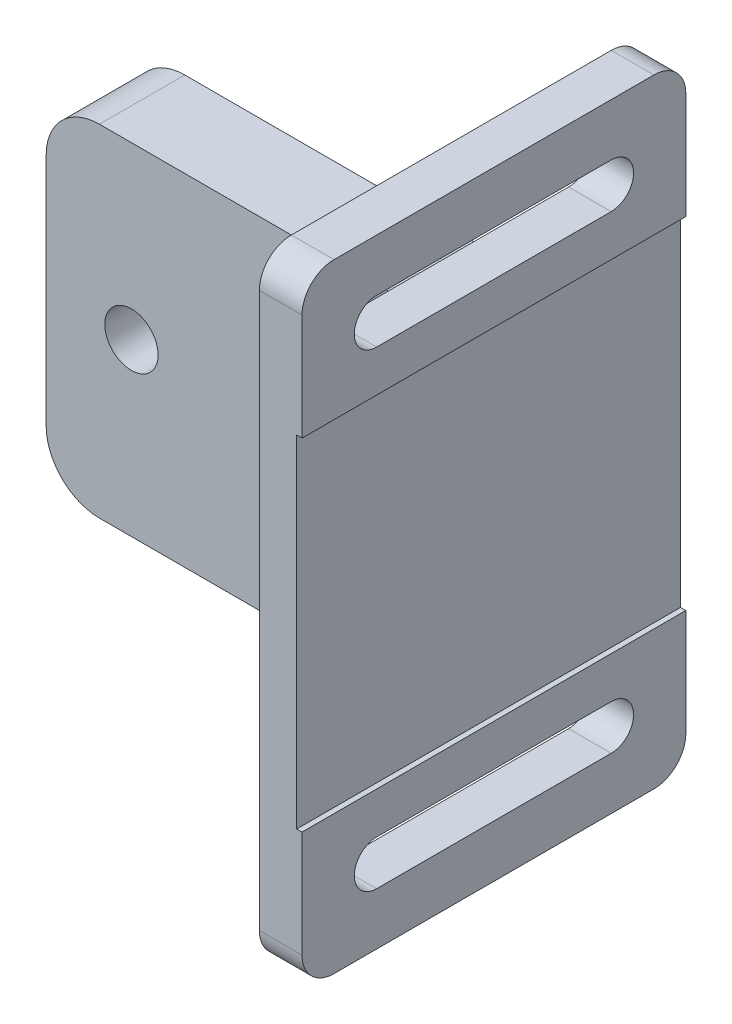
ISO-10303-21;
HEADER;
FILE_DESCRIPTION(('STEP AP214'),'2;1');
FILE_NAME('part.step','',(''),(''),'','','');
FILE_SCHEMA(('AUTOMOTIVE_DESIGN { 1 0 10303 214 1 1 1 1 }'));
ENDSEC;
DATA;
#1=APPLICATION_CONTEXT('core data for automotive mechanical design processes');
#2=APPLICATION_PROTOCOL_DEFINITION('international standard','automotive_design',2000,#1);
#3=PRODUCT_CONTEXT('',#1,'mechanical');
#4=PRODUCT('Part','Part','',(#3));
#5=PRODUCT_RELATED_PRODUCT_CATEGORY('part','',(#4));
#6=PRODUCT_DEFINITION_FORMATION('','',#4);
#7=PRODUCT_DEFINITION_CONTEXT('part definition',#1,'design');
#8=PRODUCT_DEFINITION('design','',#6,#7);
#9=PRODUCT_DEFINITION_SHAPE('','',#8);
#10=(LENGTH_UNIT() NAMED_UNIT(*) SI_UNIT(.MILLI.,.METRE.));
#11=(NAMED_UNIT(*) PLANE_ANGLE_UNIT() SI_UNIT($,.RADIAN.));
#12=(NAMED_UNIT(*) SI_UNIT($,.STERADIAN.) SOLID_ANGLE_UNIT());
#13=UNCERTAINTY_MEASURE_WITH_UNIT(LENGTH_MEASURE(1.E-05),#10,'distance_accuracy_value','');
#14=(GEOMETRIC_REPRESENTATION_CONTEXT(3) GLOBAL_UNCERTAINTY_ASSIGNED_CONTEXT((#13)) GLOBAL_UNIT_ASSIGNED_CONTEXT((#10,
#11,#12)) REPRESENTATION_CONTEXT('',''));
#15=CARTESIAN_POINT('',(0.,0.,0.));
#16=DIRECTION('',(0.,0.,1.));
#17=DIRECTION('',(1.,0.,0.));
#18=AXIS2_PLACEMENT_3D('',#15,#16,#17);
#19=CARTESIAN_POINT('',(40.,0.,36.));
#20=DIRECTION('',(-1.,0.,0.));
#21=DIRECTION('',(0.,0.,1.));
#22=AXIS2_PLACEMENT_3D('',#19,#20,#21);
#23=PLANE('',#22);
#24=DIRECTION('',(0.,0.,-1.));
#25=VECTOR('',#24,1.);
#26=CARTESIAN_POINT('',(40.,48.9,29.));
#27=LINE('',#26,#25);
#28=CARTESIAN_POINT('',(40.,48.9,29.));
#29=VERTEX_POINT('',#28);
#30=CARTESIAN_POINT('',(40.,48.9,7.));
#31=VERTEX_POINT('',#30);
#32=EDGE_CURVE('E286',#29,#31,#27,.T.);
#33=ORIENTED_EDGE('',*,*,#32,.F.);
#34=CARTESIAN_POINT('',(40.,51.,29.));
#35=DIRECTION('',(1.,0.,0.));
#36=DIRECTION('',(0.,0.,-1.));
#37=AXIS2_PLACEMENT_3D('',#34,#35,#36);
#38=CIRCLE('',#37,2.1);
#39=CARTESIAN_POINT('',(40.,53.1,29.));
#40=VERTEX_POINT('',#39);
#41=EDGE_CURVE('E278',#40,#29,#38,.T.);
#42=ORIENTED_EDGE('',*,*,#41,.F.);
#43=DIRECTION('',(0.,0.,1.));
#44=VECTOR('',#43,1.);
#45=CARTESIAN_POINT('',(40.,53.1,29.));
#46=LINE('',#45,#44);
#47=CARTESIAN_POINT('',(40.,53.1,7.));
#48=VERTEX_POINT('',#47);
#49=EDGE_CURVE('E292',#48,#40,#46,.T.);
#50=ORIENTED_EDGE('',*,*,#49,.F.);
#51=CARTESIAN_POINT('',(40.,51.,7.));
#52=DIRECTION('',(1.,0.,0.));
#53=DIRECTION('',(0.,0.,-1.));
#54=AXIS2_PLACEMENT_3D('',#51,#52,#53);
#55=CIRCLE('',#54,2.1);
#56=EDGE_CURVE('E289',#31,#48,#55,.T.);
#57=ORIENTED_EDGE('',*,*,#56,.F.);
#58=EDGE_LOOP('',(#33,#42,#50,#57));
#59=FACE_BOUND('',#58,.T.);
#60=DIRECTION('',(0.,1.,0.));
#61=VECTOR('',#60,1.);
#62=CARTESIAN_POINT('',(40.,0.,36.));
#63=LINE('',#62,#61);
#64=CARTESIAN_POINT('',(40.,45.,36.));
#65=VERTEX_POINT('',#64);
#66=CARTESIAN_POINT('',(40.,55.,36.));
#67=VERTEX_POINT('',#66);
#68=EDGE_CURVE('E335',#65,#67,#63,.T.);
#69=ORIENTED_EDGE('',*,*,#68,.F.);
#70=DIRECTION('',(0.,0.,1.));
#71=VECTOR('',#70,1.);
#72=CARTESIAN_POINT('',(40.,45.,36.));
#73=LINE('',#72,#71);
#74=CARTESIAN_POINT('',(40.,45.,0.));
#75=VERTEX_POINT('',#74);
#76=EDGE_CURVE('E229',#75,#65,#73,.T.);
#77=ORIENTED_EDGE('',*,*,#76,.F.);
#78=DIRECTION('',(0.,1.,0.));
#79=VECTOR('',#78,1.);
#80=CARTESIAN_POINT('',(40.,0.,0.));
#81=LINE('',#80,#79);
#82=CARTESIAN_POINT('',(40.,55.,0.));
#83=VERTEX_POINT('',#82);
#84=EDGE_CURVE('E332',#75,#83,#81,.T.);
#85=ORIENTED_EDGE('',*,*,#84,.T.);
#86=CARTESIAN_POINT('',(40.,55.,3.));
#87=DIRECTION('',(-1.,0.,0.));
#88=DIRECTION('',(0.,0.,1.));
#89=AXIS2_PLACEMENT_3D('',#86,#87,#88);
#90=CIRCLE('',#89,3.);
#91=CARTESIAN_POINT('',(40.,58.,3.));
#92=VERTEX_POINT('',#91);
#93=EDGE_CURVE('E374',#83,#92,#90,.F.);
#94=ORIENTED_EDGE('',*,*,#93,.T.);
#95=DIRECTION('',(0.,0.,-1.));
#96=VECTOR('',#95,1.);
#97=CARTESIAN_POINT('',(40.,58.,36.));
#98=LINE('',#97,#96);
#99=CARTESIAN_POINT('',(40.,58.,33.));
#100=VERTEX_POINT('',#99);
#101=EDGE_CURVE('E334',#100,#92,#98,.T.);
#102=ORIENTED_EDGE('',*,*,#101,.F.);
#103=CARTESIAN_POINT('',(40.,55.,33.));
#104=DIRECTION('',(-1.,0.,0.));
#105=DIRECTION('',(0.,0.,1.));
#106=AXIS2_PLACEMENT_3D('',#103,#104,#105);
#107=CIRCLE('',#106,3.);
#108=EDGE_CURVE('E371',#100,#67,#107,.F.);
#109=ORIENTED_EDGE('',*,*,#108,.T.);
#110=EDGE_LOOP('',(#69,#77,#85,#94,#102,#109));
#111=FACE_BOUND('',#110,.T.);
#112=ADVANCED_FACE('F41',(#59,#111),#23,.F.);
#113=CARTESIAN_POINT('',(0.,0.,0.));
#114=DIRECTION('',(0.,0.,-1.));
#115=DIRECTION('',(-1.,0.,0.));
#116=AXIS2_PLACEMENT_3D('',#113,#114,#115);
#117=PLANE('',#116);
#118=DIRECTION('',(1.,0.,0.));
#119=VECTOR('',#118,1.);
#120=CARTESIAN_POINT('',(39.5,45.,0.));
#121=LINE('',#120,#119);
#122=CARTESIAN_POINT('',(39.5,45.,0.));
#123=VERTEX_POINT('',#122);
#124=EDGE_CURVE('E237',#123,#75,#121,.T.);
#125=ORIENTED_EDGE('',*,*,#124,.F.);
#126=DIRECTION('',(0.,1.,0.));
#127=VECTOR('',#126,1.);
#128=CARTESIAN_POINT('',(39.5,45.,0.));
#129=LINE('',#128,#127);
#130=CARTESIAN_POINT('',(39.5,13.,0.));
#131=VERTEX_POINT('',#130);
#132=EDGE_CURVE('E219',#131,#123,#129,.T.);
#133=ORIENTED_EDGE('',*,*,#132,.F.);
#134=DIRECTION('',(1.,0.,0.));
#135=VECTOR('',#134,1.);
#136=CARTESIAN_POINT('',(39.5,13.,0.));
#137=LINE('',#136,#135);
#138=CARTESIAN_POINT('',(40.,13.,0.));
#139=VERTEX_POINT('',#138);
#140=EDGE_CURVE('E216',#131,#139,#137,.T.);
#141=ORIENTED_EDGE('',*,*,#140,.T.);
#142=CARTESIAN_POINT('',(40.,3.,0.));
#143=VERTEX_POINT('',#142);
#144=EDGE_CURVE('E336',#143,#139,#81,.T.);
#145=ORIENTED_EDGE('',*,*,#144,.F.);
#146=DIRECTION('',(1.,0.,0.));
#147=VECTOR('',#146,1.);
#148=CARTESIAN_POINT('',(36.,3.,0.));
#149=LINE('',#148,#147);
#150=CARTESIAN_POINT('',(36.,3.,0.));
#151=VERTEX_POINT('',#150);
#152=EDGE_CURVE('E381',#143,#151,#149,.F.);
#153=ORIENTED_EDGE('',*,*,#152,.T.);
#154=DIRECTION('',(0.,1.,0.));
#155=VECTOR('',#154,1.);
#156=CARTESIAN_POINT('',(36.,58.,0.));
#157=LINE('',#156,#155);
#158=CARTESIAN_POINT('',(36.,55.,0.));
#159=VERTEX_POINT('',#158);
#160=EDGE_CURVE('E326',#151,#159,#157,.T.);
#161=ORIENTED_EDGE('',*,*,#160,.T.);
#162=DIRECTION('',(-1.,0.,0.));
#163=VECTOR('',#162,1.);
#164=CARTESIAN_POINT('',(40.,55.,0.));
#165=LINE('',#164,#163);
#166=EDGE_CURVE('E378',#159,#83,#165,.F.);
#167=ORIENTED_EDGE('',*,*,#166,.T.);
#168=ORIENTED_EDGE('',*,*,#84,.F.);
#169=EDGE_LOOP('',(#125,#133,#141,#145,#153,#161,#167,#168));
#170=FACE_BOUND('',#169,.T.);
#171=ADVANCED_FACE('F490',(#170),#117,.T.);
#172=CARTESIAN_POINT('',(0.,0.,36.));
#173=DIRECTION('',(0.,0.,-1.));
#174=DIRECTION('',(-1.,0.,0.));
#175=AXIS2_PLACEMENT_3D('',#172,#173,#174);
#176=PLANE('',#175);
#177=DIRECTION('',(0.,-1.,0.));
#178=VECTOR('',#177,1.);
#179=CARTESIAN_POINT('',(39.5,45.,36.));
#180=LINE('',#179,#178);
#181=CARTESIAN_POINT('',(39.5,45.,36.));
#182=VERTEX_POINT('',#181);
#183=CARTESIAN_POINT('',(39.5,13.,36.));
#184=VERTEX_POINT('',#183);
#185=EDGE_CURVE('E220',#182,#184,#180,.T.);
#186=ORIENTED_EDGE('',*,*,#185,.F.);
#187=DIRECTION('',(1.,0.,0.));
#188=VECTOR('',#187,1.);
#189=CARTESIAN_POINT('',(39.5,45.,36.));
#190=LINE('',#189,#188);
#191=EDGE_CURVE('E250',#182,#65,#190,.T.);
#192=ORIENTED_EDGE('',*,*,#191,.T.);
#193=ORIENTED_EDGE('',*,*,#68,.T.);
#194=DIRECTION('',(-1.,0.,0.));
#195=VECTOR('',#194,1.);
#196=CARTESIAN_POINT('',(0.,55.,36.));
#197=LINE('',#196,#195);
#198=CARTESIAN_POINT('',(36.,55.,36.));
#199=VERTEX_POINT('',#198);
#200=EDGE_CURVE('E398',#67,#199,#197,.T.);
#201=ORIENTED_EDGE('',*,*,#200,.T.);
#202=DIRECTION('',(0.,-1.,0.));
#203=VECTOR('',#202,1.);
#204=CARTESIAN_POINT('',(36.,58.,36.));
#205=LINE('',#204,#203);
#206=CARTESIAN_POINT('',(36.,3.,36.));
#207=VERTEX_POINT('',#206);
#208=EDGE_CURVE('E320',#199,#207,#205,.T.);
#209=ORIENTED_EDGE('',*,*,#208,.T.);
#210=DIRECTION('',(1.,0.,0.));
#211=VECTOR('',#210,1.);
#212=CARTESIAN_POINT('',(0.,3.,36.));
#213=LINE('',#212,#211);
#214=CARTESIAN_POINT('',(40.,3.,36.));
#215=VERTEX_POINT('',#214);
#216=EDGE_CURVE('E396',#207,#215,#213,.T.);
#217=ORIENTED_EDGE('',*,*,#216,.T.);
#218=CARTESIAN_POINT('',(40.,13.,36.));
#219=VERTEX_POINT('',#218);
#220=EDGE_CURVE('E235',#215,#219,#63,.T.);
#221=ORIENTED_EDGE('',*,*,#220,.T.);
#222=DIRECTION('',(1.,0.,0.));
#223=VECTOR('',#222,1.);
#224=CARTESIAN_POINT('',(39.5,13.,36.));
#225=LINE('',#224,#223);
#226=EDGE_CURVE('E56',#184,#219,#225,.T.);
#227=ORIENTED_EDGE('',*,*,#226,.F.);
#228=EDGE_LOOP('',(#186,#192,#193,#201,#209,#217,#221,#227));
#229=FACE_BOUND('',#228,.T.);
#230=ADVANCED_FACE('F232',(#229),#176,.F.);
#231=CARTESIAN_POINT('',(0.,0.,36.));
#232=DIRECTION('',(0.,1.,0.));
#233=DIRECTION('',(0.,0.,1.));
#234=AXIS2_PLACEMENT_3D('',#231,#232,#233);
#235=PLANE('',#234);
#236=DIRECTION('',(0.,0.,-1.));
#237=VECTOR('',#236,1.);
#238=CARTESIAN_POINT('',(36.,0.,36.));
#239=LINE('',#238,#237);
#240=CARTESIAN_POINT('',(36.,0.,33.));
#241=VERTEX_POINT('',#240);
#242=CARTESIAN_POINT('',(36.,0.,3.));
#243=VERTEX_POINT('',#242);
#244=EDGE_CURVE('E307',#241,#243,#239,.T.);
#245=ORIENTED_EDGE('',*,*,#244,.T.);
#246=DIRECTION('',(1.,0.,0.));
#247=VECTOR('',#246,1.);
#248=CARTESIAN_POINT('',(40.,0.,3.));
#249=LINE('',#248,#247);
#250=CARTESIAN_POINT('',(40.,0.,3.));
#251=VERTEX_POINT('',#250);
#252=EDGE_CURVE('E366',#243,#251,#249,.T.);
#253=ORIENTED_EDGE('',*,*,#252,.T.);
#254=DIRECTION('',(0.,0.,-1.));
#255=VECTOR('',#254,1.);
#256=CARTESIAN_POINT('',(40.,0.,36.));
#257=LINE('',#256,#255);
#258=CARTESIAN_POINT('',(40.,0.,33.));
#259=VERTEX_POINT('',#258);
#260=EDGE_CURVE('E341',#259,#251,#257,.T.);
#261=ORIENTED_EDGE('',*,*,#260,.F.);
#262=DIRECTION('',(1.,0.,0.));
#263=VECTOR('',#262,1.);
#264=CARTESIAN_POINT('',(0.,0.,33.));
#265=LINE('',#264,#263);
#266=EDGE_CURVE('E362',#259,#241,#265,.F.);
#267=ORIENTED_EDGE('',*,*,#266,.T.);
#268=EDGE_LOOP('',(#245,#253,#261,#267));
#269=FACE_BOUND('',#268,.T.);
#270=ADVANCED_FACE('F463',(#269),#235,.F.);
#271=CARTESIAN_POINT('',(0.,58.,36.));
#272=DIRECTION('',(0.,-1.,0.));
#273=DIRECTION('',(0.,0.,-1.));
#274=AXIS2_PLACEMENT_3D('',#271,#272,#273);
#275=PLANE('',#274);
#276=ORIENTED_EDGE('',*,*,#101,.T.);
#277=DIRECTION('',(-1.,0.,0.));
#278=VECTOR('',#277,1.);
#279=CARTESIAN_POINT('',(36.,58.,3.));
#280=LINE('',#279,#278);
#281=CARTESIAN_POINT('',(36.,58.,3.));
#282=VERTEX_POINT('',#281);
#283=EDGE_CURVE('E393',#92,#282,#280,.T.);
#284=ORIENTED_EDGE('',*,*,#283,.T.);
#285=DIRECTION('',(0.,0.,1.));
#286=VECTOR('',#285,1.);
#287=CARTESIAN_POINT('',(36.,58.,0.));
#288=LINE('',#287,#286);
#289=CARTESIAN_POINT('',(36.,58.,33.));
#290=VERTEX_POINT('',#289);
#291=EDGE_CURVE('E323',#282,#290,#288,.T.);
#292=ORIENTED_EDGE('',*,*,#291,.T.);
#293=DIRECTION('',(-1.,0.,0.));
#294=VECTOR('',#293,1.);
#295=CARTESIAN_POINT('',(0.,58.,33.));
#296=LINE('',#295,#294);
#297=EDGE_CURVE('E391',#290,#100,#296,.F.);
#298=ORIENTED_EDGE('',*,*,#297,.T.);
#299=EDGE_LOOP('',(#276,#284,#292,#298));
#300=FACE_BOUND('',#299,.T.);
#301=ADVANCED_FACE('F477',(#300),#275,.F.);
#302=CARTESIAN_POINT('',(0.,0.,36.));
#303=DIRECTION('',(1.,0.,0.));
#304=DIRECTION('',(0.,0.,-1.));
#305=AXIS2_PLACEMENT_3D('',#302,#303,#304);
#306=PLANE('',#305);
#307=DIRECTION('',(0.,1.,0.));
#308=VECTOR('',#307,1.);
#309=CARTESIAN_POINT('',(0.,45.,12.));
#310=LINE('',#309,#308);
#311=CARTESIAN_POINT('',(0.,18.,12.));
#312=VERTEX_POINT('',#311);
#313=CARTESIAN_POINT('',(0.,40.,12.));
#314=VERTEX_POINT('',#313);
#315=EDGE_CURVE('E246',#312,#314,#310,.T.);
#316=ORIENTED_EDGE('',*,*,#315,.F.);
#317=DIRECTION('',(0.,0.,-1.));
#318=VECTOR('',#317,1.);
#319=CARTESIAN_POINT('',(0.,18.,36.));
#320=LINE('',#319,#318);
#321=CARTESIAN_POINT('',(0.,18.,20.));
#322=VERTEX_POINT('',#321);
#323=EDGE_CURVE('E410',#312,#322,#320,.F.);
#324=ORIENTED_EDGE('',*,*,#323,.T.);
#325=DIRECTION('',(0.,-1.,0.));
#326=VECTOR('',#325,1.);
#327=CARTESIAN_POINT('',(0.,45.,20.));
#328=LINE('',#327,#326);
#329=CARTESIAN_POINT('',(0.,40.,20.));
#330=VERTEX_POINT('',#329);
#331=EDGE_CURVE('E298',#330,#322,#328,.T.);
#332=ORIENTED_EDGE('',*,*,#331,.F.);
#333=DIRECTION('',(0.,0.,1.));
#334=VECTOR('',#333,1.);
#335=CARTESIAN_POINT('',(0.,40.,36.));
#336=LINE('',#335,#334);
#337=EDGE_CURVE('E408',#330,#314,#336,.F.);
#338=ORIENTED_EDGE('',*,*,#337,.T.);
#339=EDGE_LOOP('',(#316,#324,#332,#338));
#340=FACE_BOUND('',#339,.T.);
#341=ADVANCED_FACE('F432',(#340),#306,.F.);
#342=DIRECTION('',(0.,0.,-1.));
#343=VECTOR('',#342,1.);
#344=CARTESIAN_POINT('',(40.,4.9,29.));
#345=LINE('',#344,#343);
#346=CARTESIAN_POINT('',(40.,4.9,29.));
#347=VERTEX_POINT('',#346);
#348=CARTESIAN_POINT('',(40.,4.9,6.99999999999999));
#349=VERTEX_POINT('',#348);
#350=EDGE_CURVE('E266',#347,#349,#345,.T.);
#351=ORIENTED_EDGE('',*,*,#350,.F.);
#352=CARTESIAN_POINT('',(40.,7.,29.));
#353=DIRECTION('',(1.,0.,0.));
#354=DIRECTION('',(0.,0.,-1.));
#355=AXIS2_PLACEMENT_3D('',#352,#353,#354);
#356=CIRCLE('',#355,2.1);
#357=CARTESIAN_POINT('',(40.,9.1,29.));
#358=VERTEX_POINT('',#357);
#359=EDGE_CURVE('E264',#358,#347,#356,.T.);
#360=ORIENTED_EDGE('',*,*,#359,.F.);
#361=DIRECTION('',(0.,0.,1.));
#362=VECTOR('',#361,1.);
#363=CARTESIAN_POINT('',(40.,9.1,29.));
#364=LINE('',#363,#362);
#365=CARTESIAN_POINT('',(40.,9.1,7.));
#366=VERTEX_POINT('',#365);
#367=EDGE_CURVE('E272',#366,#358,#364,.T.);
#368=ORIENTED_EDGE('',*,*,#367,.F.);
#369=CARTESIAN_POINT('',(40.,7.,6.99999999999999));
#370=DIRECTION('',(1.,0.,0.));
#371=DIRECTION('',(0.,0.,-1.));
#372=AXIS2_PLACEMENT_3D('',#369,#370,#371);
#373=CIRCLE('',#372,2.1);
#374=EDGE_CURVE('E269',#349,#366,#373,.T.);
#375=ORIENTED_EDGE('',*,*,#374,.F.);
#376=EDGE_LOOP('',(#351,#360,#368,#375));
#377=FACE_BOUND('',#376,.T.);
#378=ORIENTED_EDGE('',*,*,#144,.T.);
#379=DIRECTION('',(0.,0.,-1.));
#380=VECTOR('',#379,1.);
#381=CARTESIAN_POINT('',(40.,13.,36.));
#382=LINE('',#381,#380);
#383=EDGE_CURVE('E492',#219,#139,#382,.T.);
#384=ORIENTED_EDGE('',*,*,#383,.F.);
#385=ORIENTED_EDGE('',*,*,#220,.F.);
#386=CARTESIAN_POINT('',(40.,3.,33.));
#387=DIRECTION('',(-1.,0.,0.));
#388=DIRECTION('',(0.,0.,1.));
#389=AXIS2_PLACEMENT_3D('',#386,#387,#388);
#390=CIRCLE('',#389,3.);
#391=EDGE_CURVE('E369',#215,#259,#390,.F.);
#392=ORIENTED_EDGE('',*,*,#391,.T.);
#393=ORIENTED_EDGE('',*,*,#260,.T.);
#394=CARTESIAN_POINT('',(40.,3.,3.));
#395=DIRECTION('',(-1.,0.,0.));
#396=DIRECTION('',(0.,0.,1.));
#397=AXIS2_PLACEMENT_3D('',#394,#395,#396);
#398=CIRCLE('',#397,3.);
#399=EDGE_CURVE('E376',#251,#143,#398,.F.);
#400=ORIENTED_EDGE('',*,*,#399,.T.);
#401=EDGE_LOOP('',(#378,#384,#385,#392,#393,#400));
#402=FACE_BOUND('',#401,.T.);
#403=ADVANCED_FACE('F466',(#377,#402),#23,.F.);
#404=CARTESIAN_POINT('',(78.2753184180093,45.,0.));
#405=DIRECTION('',(0.,-1.,0.));
#406=DIRECTION('',(0.,0.,-1.));
#407=AXIS2_PLACEMENT_3D('',#404,#405,#406);
#408=PLANE('',#407);
#409=DIRECTION('',(-1.,0.,0.));
#410=VECTOR('',#409,1.);
#411=CARTESIAN_POINT('',(70.1760149812701,45.,12.));
#412=LINE('',#411,#410);
#413=CARTESIAN_POINT('',(36.,45.,12.));
#414=VERTEX_POINT('',#413);
#415=CARTESIAN_POINT('',(5.,45.,12.));
#416=VERTEX_POINT('',#415);
#417=EDGE_CURVE('E245',#414,#416,#412,.T.);
#418=ORIENTED_EDGE('',*,*,#417,.T.);
#419=DIRECTION('',(0.,0.,1.));
#420=VECTOR('',#419,1.);
#421=CARTESIAN_POINT('',(5.,45.,0.));
#422=LINE('',#421,#420);
#423=CARTESIAN_POINT('',(5.,45.,20.));
#424=VERTEX_POINT('',#423);
#425=EDGE_CURVE('E12',#416,#424,#422,.T.);
#426=ORIENTED_EDGE('',*,*,#425,.T.);
#427=DIRECTION('',(-1.,0.,0.));
#428=VECTOR('',#427,1.);
#429=CARTESIAN_POINT('',(71.7770876399966,45.,20.));
#430=LINE('',#429,#428);
#431=CARTESIAN_POINT('',(36.,45.,20.));
#432=VERTEX_POINT('',#431);
#433=EDGE_CURVE('E311',#432,#424,#430,.T.);
#434=ORIENTED_EDGE('',*,*,#433,.F.);
#435=DIRECTION('',(0.,0.,-1.));
#436=VECTOR('',#435,1.);
#437=CARTESIAN_POINT('',(36.,45.,0.));
#438=LINE('',#437,#436);
#439=EDGE_CURVE('E329',#432,#414,#438,.T.);
#440=ORIENTED_EDGE('',*,*,#439,.T.);
#441=EDGE_LOOP('',(#418,#426,#434,#440));
#442=FACE_BOUND('',#441,.T.);
#443=ADVANCED_FACE('F435',(#442),#408,.F.);
#444=CARTESIAN_POINT('',(36.,0.,36.));
#445=DIRECTION('',(-1.,0.,0.));
#446=DIRECTION('',(0.,0.,1.));
#447=AXIS2_PLACEMENT_3D('',#444,#445,#446);
#448=PLANE('',#447);
#449=DIRECTION('',(0.,-1.,0.));
#450=VECTOR('',#449,1.);
#451=CARTESIAN_POINT('',(36.,45.,12.));
#452=LINE('',#451,#450);
#453=CARTESIAN_POINT('',(36.,13.,12.));
#454=VERTEX_POINT('',#453);
#455=EDGE_CURVE('E242',#414,#454,#452,.T.);
#456=ORIENTED_EDGE('',*,*,#455,.F.);
#457=ORIENTED_EDGE('',*,*,#439,.F.);
#458=DIRECTION('',(0.,1.,0.));
#459=VECTOR('',#458,1.);
#460=CARTESIAN_POINT('',(36.,45.,20.));
#461=LINE('',#460,#459);
#462=CARTESIAN_POINT('',(36.,13.,20.));
#463=VERTEX_POINT('',#462);
#464=EDGE_CURVE('E305',#463,#432,#461,.T.);
#465=ORIENTED_EDGE('',*,*,#464,.F.);
#466=DIRECTION('',(0.,0.,1.));
#467=VECTOR('',#466,1.);
#468=CARTESIAN_POINT('',(36.,13.,36.));
#469=LINE('',#468,#467);
#470=EDGE_CURVE('E318',#454,#463,#469,.T.);
#471=ORIENTED_EDGE('',*,*,#470,.F.);
#472=EDGE_LOOP('',(#456,#457,#465,#471));
#473=FACE_BOUND('',#472,.T.);
#474=CARTESIAN_POINT('',(36.,7.,29.));
#475=DIRECTION('',(-1.,0.,0.));
#476=DIRECTION('',(0.,0.,1.));
#477=AXIS2_PLACEMENT_3D('',#474,#475,#476);
#478=CIRCLE('',#477,2.1);
#479=CARTESIAN_POINT('',(36.,4.9,29.));
#480=VERTEX_POINT('',#479);
#481=CARTESIAN_POINT('',(36.,9.1,29.));
#482=VERTEX_POINT('',#481);
#483=EDGE_CURVE('E360',#480,#482,#478,.T.);
#484=ORIENTED_EDGE('',*,*,#483,.F.);
#485=DIRECTION('',(0.,0.,1.));
#486=VECTOR('',#485,1.);
#487=CARTESIAN_POINT('',(36.,4.9,36.));
#488=LINE('',#487,#486);
#489=CARTESIAN_POINT('',(36.,4.9,6.99999999999999));
#490=VERTEX_POINT('',#489);
#491=EDGE_CURVE('E353',#490,#480,#488,.T.);
#492=ORIENTED_EDGE('',*,*,#491,.F.);
#493=CARTESIAN_POINT('',(36.,7.,6.99999999999999));
#494=DIRECTION('',(-1.,0.,0.));
#495=DIRECTION('',(0.,0.,1.));
#496=AXIS2_PLACEMENT_3D('',#493,#494,#495);
#497=CIRCLE('',#496,2.1);
#498=CARTESIAN_POINT('',(36.,9.1,7.));
#499=VERTEX_POINT('',#498);
#500=EDGE_CURVE('E355',#499,#490,#497,.T.);
#501=ORIENTED_EDGE('',*,*,#500,.F.);
#502=DIRECTION('',(0.,0.,-1.));
#503=VECTOR('',#502,1.);
#504=CARTESIAN_POINT('',(36.,9.1,36.));
#505=LINE('',#504,#503);
#506=EDGE_CURVE('E358',#482,#499,#505,.T.);
#507=ORIENTED_EDGE('',*,*,#506,.F.);
#508=EDGE_LOOP('',(#484,#492,#501,#507));
#509=FACE_BOUND('',#508,.T.);
#510=CARTESIAN_POINT('',(36.,51.,29.));
#511=DIRECTION('',(-1.,0.,0.));
#512=DIRECTION('',(0.,0.,1.));
#513=AXIS2_PLACEMENT_3D('',#510,#511,#512);
#514=CIRCLE('',#513,2.1);
#515=CARTESIAN_POINT('',(36.,48.9,29.));
#516=VERTEX_POINT('',#515);
#517=CARTESIAN_POINT('',(36.,53.1,29.));
#518=VERTEX_POINT('',#517);
#519=EDGE_CURVE('E351',#516,#518,#514,.T.);
#520=ORIENTED_EDGE('',*,*,#519,.F.);
#521=DIRECTION('',(0.,0.,1.));
#522=VECTOR('',#521,1.);
#523=CARTESIAN_POINT('',(36.,48.9,36.));
#524=LINE('',#523,#522);
#525=CARTESIAN_POINT('',(36.,48.9,7.));
#526=VERTEX_POINT('',#525);
#527=EDGE_CURVE('E344',#526,#516,#524,.T.);
#528=ORIENTED_EDGE('',*,*,#527,.F.);
#529=CARTESIAN_POINT('',(36.,51.,7.));
#530=DIRECTION('',(-1.,0.,0.));
#531=DIRECTION('',(0.,0.,1.));
#532=AXIS2_PLACEMENT_3D('',#529,#530,#531);
#533=CIRCLE('',#532,2.1);
#534=CARTESIAN_POINT('',(36.,53.1,7.));
#535=VERTEX_POINT('',#534);
#536=EDGE_CURVE('E346',#535,#526,#533,.T.);
#537=ORIENTED_EDGE('',*,*,#536,.F.);
#538=DIRECTION('',(0.,0.,-1.));
#539=VECTOR('',#538,1.);
#540=CARTESIAN_POINT('',(36.,53.1,36.));
#541=LINE('',#540,#539);
#542=EDGE_CURVE('E349',#518,#535,#541,.T.);
#543=ORIENTED_EDGE('',*,*,#542,.F.);
#544=EDGE_LOOP('',(#520,#528,#537,#543));
#545=FACE_BOUND('',#544,.T.);
#546=ORIENTED_EDGE('',*,*,#160,.F.);
#547=CARTESIAN_POINT('',(36.,3.,3.));
#548=DIRECTION('',(-1.,0.,0.));
#549=DIRECTION('',(0.,0.,1.));
#550=AXIS2_PLACEMENT_3D('',#547,#548,#549);
#551=CIRCLE('',#550,3.);
#552=EDGE_CURVE('E389',#151,#243,#551,.T.);
#553=ORIENTED_EDGE('',*,*,#552,.T.);
#554=ORIENTED_EDGE('',*,*,#244,.F.);
#555=CARTESIAN_POINT('',(36.,3.,33.));
#556=DIRECTION('',(-1.,0.,0.));
#557=DIRECTION('',(0.,0.,1.));
#558=AXIS2_PLACEMENT_3D('',#555,#556,#557);
#559=CIRCLE('',#558,3.);
#560=EDGE_CURVE('E383',#241,#207,#559,.T.);
#561=ORIENTED_EDGE('',*,*,#560,.T.);
#562=ORIENTED_EDGE('',*,*,#208,.F.);
#563=CARTESIAN_POINT('',(36.,55.,33.));
#564=DIRECTION('',(-1.,0.,0.));
#565=DIRECTION('',(0.,0.,1.));
#566=AXIS2_PLACEMENT_3D('',#563,#564,#565);
#567=CIRCLE('',#566,3.);
#568=EDGE_CURVE('E385',#199,#290,#567,.T.);
#569=ORIENTED_EDGE('',*,*,#568,.T.);
#570=ORIENTED_EDGE('',*,*,#291,.F.);
#571=CARTESIAN_POINT('',(36.,55.,3.));
#572=DIRECTION('',(-1.,0.,0.));
#573=DIRECTION('',(0.,0.,1.));
#574=AXIS2_PLACEMENT_3D('',#571,#572,#573);
#575=CIRCLE('',#574,3.);
#576=EDGE_CURVE('E387',#282,#159,#575,.T.);
#577=ORIENTED_EDGE('',*,*,#576,.T.);
#578=EDGE_LOOP('',(#546,#553,#554,#561,#562,#569,#570,#577));
#579=FACE_BOUND('',#578,.T.);
#580=ADVANCED_FACE('F439',(#473,#509,#545,#579),#448,.T.);
#581=CARTESIAN_POINT('',(78.2753184180093,13.,36.));
#582=DIRECTION('',(0.,1.,0.));
#583=DIRECTION('',(0.,0.,1.));
#584=AXIS2_PLACEMENT_3D('',#581,#582,#583);
#585=PLANE('',#584);
#586=DIRECTION('',(-1.,0.,0.));
#587=VECTOR('',#586,1.);
#588=CARTESIAN_POINT('',(71.7770876399966,13.,20.));
#589=LINE('',#588,#587);
#590=CARTESIAN_POINT('',(5.,13.,20.));
#591=VERTEX_POINT('',#590);
#592=EDGE_CURVE('E308',#463,#591,#589,.T.);
#593=ORIENTED_EDGE('',*,*,#592,.T.);
#594=DIRECTION('',(0.,0.,-1.));
#595=VECTOR('',#594,1.);
#596=CARTESIAN_POINT('',(5.,13.,36.));
#597=LINE('',#596,#595);
#598=CARTESIAN_POINT('',(5.,13.,12.));
#599=VERTEX_POINT('',#598);
#600=EDGE_CURVE('E401',#591,#599,#597,.T.);
#601=ORIENTED_EDGE('',*,*,#600,.T.);
#602=DIRECTION('',(-1.,0.,0.));
#603=VECTOR('',#602,1.);
#604=CARTESIAN_POINT('',(70.1760149812701,13.,12.));
#605=LINE('',#604,#603);
#606=EDGE_CURVE('E249',#454,#599,#605,.T.);
#607=ORIENTED_EDGE('',*,*,#606,.F.);
#608=ORIENTED_EDGE('',*,*,#470,.T.);
#609=EDGE_LOOP('',(#593,#601,#607,#608));
#610=FACE_BOUND('',#609,.T.);
#611=ADVANCED_FACE('F422',(#610),#585,.F.);
#612=CARTESIAN_POINT('',(71.7770876399966,45.,20.));
#613=DIRECTION('',(0.,0.,-1.));
#614=DIRECTION('',(0.,1.,0.));
#615=AXIS2_PLACEMENT_3D('',#612,#613,#614);
#616=PLANE('',#615);
#617=CARTESIAN_POINT('',(26.,29.,20.));
#618=DIRECTION('',(0.,0.,1.));
#619=DIRECTION('',(1.,0.,0.));
#620=AXIS2_PLACEMENT_3D('',#617,#618,#619);
#621=CIRCLE('',#620,2.5);
#622=CARTESIAN_POINT('',(28.5,29.,20.));
#623=VERTEX_POINT('',#622);
#624=EDGE_CURVE('E258',#623,#623,#621,.T.);
#625=ORIENTED_EDGE('',*,*,#624,.F.);
#626=EDGE_LOOP('',(#625));
#627=FACE_BOUND('',#626,.T.);
#628=CARTESIAN_POINT('',(8.,29.,20.));
#629=DIRECTION('',(0.,0.,1.));
#630=DIRECTION('',(1.,0.,0.));
#631=AXIS2_PLACEMENT_3D('',#628,#629,#630);
#632=CIRCLE('',#631,2.5);
#633=CARTESIAN_POINT('',(10.5,29.,20.));
#634=VERTEX_POINT('',#633);
#635=EDGE_CURVE('E261',#634,#634,#632,.T.);
#636=ORIENTED_EDGE('',*,*,#635,.F.);
#637=EDGE_LOOP('',(#636));
#638=FACE_BOUND('',#637,.T.);
#639=ORIENTED_EDGE('',*,*,#331,.T.);
#640=CARTESIAN_POINT('',(5.,18.,20.));
#641=DIRECTION('',(0.,0.,-1.));
#642=DIRECTION('',(0.,1.,0.));
#643=AXIS2_PLACEMENT_3D('',#640,#641,#642);
#644=CIRCLE('',#643,5.);
#645=EDGE_CURVE('E49',#322,#591,#644,.F.);
#646=ORIENTED_EDGE('',*,*,#645,.T.);
#647=ORIENTED_EDGE('',*,*,#592,.F.);
#648=ORIENTED_EDGE('',*,*,#464,.T.);
#649=ORIENTED_EDGE('',*,*,#433,.T.);
#650=CARTESIAN_POINT('',(5.,40.,20.));
#651=DIRECTION('',(0.,0.,-1.));
#652=DIRECTION('',(0.,1.,0.));
#653=AXIS2_PLACEMENT_3D('',#650,#651,#652);
#654=CIRCLE('',#653,5.);
#655=EDGE_CURVE('E64',#424,#330,#654,.F.);
#656=ORIENTED_EDGE('',*,*,#655,.T.);
#657=EDGE_LOOP('',(#639,#646,#647,#648,#649,#656));
#658=FACE_BOUND('',#657,.T.);
#659=ADVANCED_FACE('F415',(#627,#638,#658),#616,.F.);
#660=CARTESIAN_POINT('',(35.,51.,29.));
#661=DIRECTION('',(1.,0.,0.));
#662=DIRECTION('',(0.,0.,-1.));
#663=AXIS2_PLACEMENT_3D('',#660,#661,#662);
#664=CYLINDRICAL_SURFACE('',#663,2.1);
#665=ORIENTED_EDGE('',*,*,#519,.T.);
#666=DIRECTION('',(1.,0.,0.));
#667=VECTOR('',#666,1.);
#668=CARTESIAN_POINT('',(35.,53.1,29.));
#669=LINE('',#668,#667);
#670=EDGE_CURVE('E296',#518,#40,#669,.T.);
#671=ORIENTED_EDGE('',*,*,#670,.T.);
#672=ORIENTED_EDGE('',*,*,#41,.T.);
#673=DIRECTION('',(1.,0.,0.));
#674=VECTOR('',#673,1.);
#675=CARTESIAN_POINT('',(35.,48.9,29.));
#676=LINE('',#675,#674);
#677=EDGE_CURVE('E295',#516,#29,#676,.T.);
#678=ORIENTED_EDGE('',*,*,#677,.F.);
#679=EDGE_LOOP('',(#665,#671,#672,#678));
#680=FACE_BOUND('',#679,.T.);
#681=ADVANCED_FACE('F557',(#680),#664,.F.);
#682=CARTESIAN_POINT('',(35.,53.1,29.));
#683=DIRECTION('',(0.,1.,0.));
#684=DIRECTION('',(0.,0.,1.));
#685=AXIS2_PLACEMENT_3D('',#682,#683,#684);
#686=PLANE('',#685);
#687=ORIENTED_EDGE('',*,*,#542,.T.);
#688=DIRECTION('',(1.,0.,0.));
#689=VECTOR('',#688,1.);
#690=CARTESIAN_POINT('',(35.,53.1,7.));
#691=LINE('',#690,#689);
#692=EDGE_CURVE('E299',#535,#48,#691,.T.);
#693=ORIENTED_EDGE('',*,*,#692,.T.);
#694=ORIENTED_EDGE('',*,*,#49,.T.);
#695=ORIENTED_EDGE('',*,*,#670,.F.);
#696=EDGE_LOOP('',(#687,#693,#694,#695));
#697=FACE_BOUND('',#696,.T.);
#698=ADVANCED_FACE('F553',(#697),#686,.F.);
#699=CARTESIAN_POINT('',(35.,51.,7.));
#700=DIRECTION('',(1.,0.,0.));
#701=DIRECTION('',(0.,0.,-1.));
#702=AXIS2_PLACEMENT_3D('',#699,#700,#701);
#703=CYLINDRICAL_SURFACE('',#702,2.1);
#704=ORIENTED_EDGE('',*,*,#536,.T.);
#705=DIRECTION('',(1.,0.,0.));
#706=VECTOR('',#705,1.);
#707=CARTESIAN_POINT('',(35.,48.9,7.));
#708=LINE('',#707,#706);
#709=EDGE_CURVE('E301',#526,#31,#708,.T.);
#710=ORIENTED_EDGE('',*,*,#709,.T.);
#711=ORIENTED_EDGE('',*,*,#56,.T.);
#712=ORIENTED_EDGE('',*,*,#692,.F.);
#713=EDGE_LOOP('',(#704,#710,#711,#712));
#714=FACE_BOUND('',#713,.T.);
#715=ADVANCED_FACE('F556',(#714),#703,.F.);
#716=CARTESIAN_POINT('',(35.,48.9,29.));
#717=DIRECTION('',(0.,-1.,0.));
#718=DIRECTION('',(0.,0.,-1.));
#719=AXIS2_PLACEMENT_3D('',#716,#717,#718);
#720=PLANE('',#719);
#721=ORIENTED_EDGE('',*,*,#527,.T.);
#722=ORIENTED_EDGE('',*,*,#677,.T.);
#723=ORIENTED_EDGE('',*,*,#32,.T.);
#724=ORIENTED_EDGE('',*,*,#709,.F.);
#725=EDGE_LOOP('',(#721,#722,#723,#724));
#726=FACE_BOUND('',#725,.T.);
#727=ADVANCED_FACE('F552',(#726),#720,.F.);
#728=CARTESIAN_POINT('',(35.,7.,29.));
#729=DIRECTION('',(1.,0.,0.));
#730=DIRECTION('',(0.,0.,-1.));
#731=AXIS2_PLACEMENT_3D('',#728,#729,#730);
#732=CYLINDRICAL_SURFACE('',#731,2.1);
#733=ORIENTED_EDGE('',*,*,#483,.T.);
#734=DIRECTION('',(1.,0.,0.));
#735=VECTOR('',#734,1.);
#736=CARTESIAN_POINT('',(35.,9.1,29.));
#737=LINE('',#736,#735);
#738=EDGE_CURVE('E276',#482,#358,#737,.T.);
#739=ORIENTED_EDGE('',*,*,#738,.T.);
#740=ORIENTED_EDGE('',*,*,#359,.T.);
#741=DIRECTION('',(1.,0.,0.));
#742=VECTOR('',#741,1.);
#743=CARTESIAN_POINT('',(35.,4.9,29.));
#744=LINE('',#743,#742);
#745=EDGE_CURVE('E275',#480,#347,#744,.T.);
#746=ORIENTED_EDGE('',*,*,#745,.F.);
#747=EDGE_LOOP('',(#733,#739,#740,#746));
#748=FACE_BOUND('',#747,.T.);
#749=ADVANCED_FACE('F531',(#748),#732,.F.);
#750=CARTESIAN_POINT('',(35.,9.1,29.));
#751=DIRECTION('',(0.,1.,0.));
#752=DIRECTION('',(0.,0.,1.));
#753=AXIS2_PLACEMENT_3D('',#750,#751,#752);
#754=PLANE('',#753);
#755=ORIENTED_EDGE('',*,*,#506,.T.);
#756=DIRECTION('',(1.,0.,0.));
#757=VECTOR('',#756,1.);
#758=CARTESIAN_POINT('',(35.,9.1,7.));
#759=LINE('',#758,#757);
#760=EDGE_CURVE('E279',#499,#366,#759,.T.);
#761=ORIENTED_EDGE('',*,*,#760,.T.);
#762=ORIENTED_EDGE('',*,*,#367,.T.);
#763=ORIENTED_EDGE('',*,*,#738,.F.);
#764=EDGE_LOOP('',(#755,#761,#762,#763));
#765=FACE_BOUND('',#764,.T.);
#766=ADVANCED_FACE('F534',(#765),#754,.F.);
#767=CARTESIAN_POINT('',(35.,7.,6.99999999999999));
#768=DIRECTION('',(1.,0.,0.));
#769=DIRECTION('',(0.,0.,-1.));
#770=AXIS2_PLACEMENT_3D('',#767,#768,#769);
#771=CYLINDRICAL_SURFACE('',#770,2.1);
#772=ORIENTED_EDGE('',*,*,#500,.T.);
#773=DIRECTION('',(1.,0.,0.));
#774=VECTOR('',#773,1.);
#775=CARTESIAN_POINT('',(35.,4.9,6.99999999999999));
#776=LINE('',#775,#774);
#777=EDGE_CURVE('E281',#490,#349,#776,.T.);
#778=ORIENTED_EDGE('',*,*,#777,.T.);
#779=ORIENTED_EDGE('',*,*,#374,.T.);
#780=ORIENTED_EDGE('',*,*,#760,.F.);
#781=EDGE_LOOP('',(#772,#778,#779,#780));
#782=FACE_BOUND('',#781,.T.);
#783=ADVANCED_FACE('F538',(#782),#771,.F.);
#784=CARTESIAN_POINT('',(35.,4.9,29.));
#785=DIRECTION('',(0.,-1.,0.));
#786=DIRECTION('',(0.,0.,-1.));
#787=AXIS2_PLACEMENT_3D('',#784,#785,#786);
#788=PLANE('',#787);
#789=ORIENTED_EDGE('',*,*,#491,.T.);
#790=ORIENTED_EDGE('',*,*,#745,.T.);
#791=ORIENTED_EDGE('',*,*,#350,.T.);
#792=ORIENTED_EDGE('',*,*,#777,.F.);
#793=EDGE_LOOP('',(#789,#790,#791,#792));
#794=FACE_BOUND('',#793,.T.);
#795=ADVANCED_FACE('F528',(#794),#788,.F.);
#796=CARTESIAN_POINT('',(8.,29.,20.));
#797=DIRECTION('',(0.,0.,1.));
#798=DIRECTION('',(1.,0.,0.));
#799=AXIS2_PLACEMENT_3D('',#796,#797,#798);
#800=CYLINDRICAL_SURFACE('',#799,2.5);
#801=CARTESIAN_POINT('',(8.,29.,12.));
#802=DIRECTION('',(0.,0.,1.));
#803=DIRECTION('',(0.,-1.,0.));
#804=AXIS2_PLACEMENT_3D('',#801,#802,#803);
#805=CIRCLE('',#804,2.5);
#806=CARTESIAN_POINT('',(8.,26.5,12.));
#807=VERTEX_POINT('',#806);
#808=EDGE_CURVE('E255',#807,#807,#805,.F.);
#809=ORIENTED_EDGE('',*,*,#808,.T.);
#810=EDGE_LOOP('',(#809));
#811=FACE_BOUND('',#810,.T.);
#812=ORIENTED_EDGE('',*,*,#635,.T.);
#813=EDGE_LOOP('',(#812));
#814=FACE_BOUND('',#813,.T.);
#815=ADVANCED_FACE('F545',(#811,#814),#800,.F.);
#816=CARTESIAN_POINT('',(26.,29.,20.));
#817=DIRECTION('',(0.,0.,1.));
#818=DIRECTION('',(1.,0.,0.));
#819=AXIS2_PLACEMENT_3D('',#816,#817,#818);
#820=CYLINDRICAL_SURFACE('',#819,2.5);
#821=CARTESIAN_POINT('',(26.,29.,12.));
#822=DIRECTION('',(0.,0.,1.));
#823=DIRECTION('',(0.,-1.,0.));
#824=AXIS2_PLACEMENT_3D('',#821,#822,#823);
#825=CIRCLE('',#824,2.5);
#826=CARTESIAN_POINT('',(26.,26.5,12.));
#827=VERTEX_POINT('',#826);
#828=EDGE_CURVE('E244',#827,#827,#825,.F.);
#829=ORIENTED_EDGE('',*,*,#828,.T.);
#830=EDGE_LOOP('',(#829));
#831=FACE_BOUND('',#830,.T.);
#832=ORIENTED_EDGE('',*,*,#624,.T.);
#833=EDGE_LOOP('',(#832));
#834=FACE_BOUND('',#833,.T.);
#835=ADVANCED_FACE('F683',(#831,#834),#820,.F.);
#836=CARTESIAN_POINT('',(70.1760149812701,45.,12.));
#837=DIRECTION('',(0.,0.,1.));
#838=DIRECTION('',(0.,-1.,0.));
#839=AXIS2_PLACEMENT_3D('',#836,#837,#838);
#840=PLANE('',#839);
#841=ORIENTED_EDGE('',*,*,#828,.F.);
#842=EDGE_LOOP('',(#841));
#843=FACE_BOUND('',#842,.T.);
#844=ORIENTED_EDGE('',*,*,#606,.T.);
#845=CARTESIAN_POINT('',(5.,18.,12.));
#846=DIRECTION('',(0.,0.,1.));
#847=DIRECTION('',(0.,-1.,0.));
#848=AXIS2_PLACEMENT_3D('',#845,#846,#847);
#849=CIRCLE('',#848,5.);
#850=EDGE_CURVE('E406',#599,#312,#849,.F.);
#851=ORIENTED_EDGE('',*,*,#850,.T.);
#852=ORIENTED_EDGE('',*,*,#315,.T.);
#853=CARTESIAN_POINT('',(5.,40.,12.));
#854=DIRECTION('',(0.,0.,1.));
#855=DIRECTION('',(0.,-1.,0.));
#856=AXIS2_PLACEMENT_3D('',#853,#854,#855);
#857=CIRCLE('',#856,5.);
#858=EDGE_CURVE('E404',#314,#416,#857,.F.);
#859=ORIENTED_EDGE('',*,*,#858,.T.);
#860=ORIENTED_EDGE('',*,*,#417,.F.);
#861=ORIENTED_EDGE('',*,*,#455,.T.);
#862=EDGE_LOOP('',(#844,#851,#852,#859,#860,#861));
#863=FACE_BOUND('',#862,.T.);
#864=ORIENTED_EDGE('',*,*,#808,.F.);
#865=EDGE_LOOP('',(#864));
#866=FACE_BOUND('',#865,.T.);
#867=ADVANCED_FACE('F428',(#843,#863,#866),#840,.F.);
#868=CARTESIAN_POINT('',(0.,3.,3.));
#869=DIRECTION('',(-1.,0.,0.));
#870=DIRECTION('',(0.,0.,1.));
#871=AXIS2_PLACEMENT_3D('',#868,#869,#870);
#872=CYLINDRICAL_SURFACE('',#871,3.);
#873=ORIENTED_EDGE('',*,*,#552,.F.);
#874=ORIENTED_EDGE('',*,*,#152,.F.);
#875=ORIENTED_EDGE('',*,*,#399,.F.);
#876=ORIENTED_EDGE('',*,*,#252,.F.);
#877=EDGE_LOOP('',(#873,#874,#875,#876));
#878=FACE_BOUND('',#877,.T.);
#879=ADVANCED_FACE('F460',(#878),#872,.T.);
#880=CARTESIAN_POINT('',(0.,55.,3.));
#881=DIRECTION('',(1.,0.,0.));
#882=DIRECTION('',(0.,0.,-1.));
#883=AXIS2_PLACEMENT_3D('',#880,#881,#882);
#884=CYLINDRICAL_SURFACE('',#883,3.);
#885=ORIENTED_EDGE('',*,*,#93,.F.);
#886=ORIENTED_EDGE('',*,*,#166,.F.);
#887=ORIENTED_EDGE('',*,*,#576,.F.);
#888=ORIENTED_EDGE('',*,*,#283,.F.);
#889=EDGE_LOOP('',(#885,#886,#887,#888));
#890=FACE_BOUND('',#889,.T.);
#891=ADVANCED_FACE('F487',(#890),#884,.T.);
#892=CARTESIAN_POINT('',(0.,55.,33.));
#893=DIRECTION('',(-1.,0.,0.));
#894=DIRECTION('',(0.,0.,1.));
#895=AXIS2_PLACEMENT_3D('',#892,#893,#894);
#896=CYLINDRICAL_SURFACE('',#895,3.);
#897=ORIENTED_EDGE('',*,*,#108,.F.);
#898=ORIENTED_EDGE('',*,*,#297,.F.);
#899=ORIENTED_EDGE('',*,*,#568,.F.);
#900=ORIENTED_EDGE('',*,*,#200,.F.);
#901=EDGE_LOOP('',(#897,#898,#899,#900));
#902=FACE_BOUND('',#901,.T.);
#903=ADVANCED_FACE('F481',(#902),#896,.T.);
#904=CARTESIAN_POINT('',(0.,3.,33.));
#905=DIRECTION('',(1.,0.,0.));
#906=DIRECTION('',(0.,0.,-1.));
#907=AXIS2_PLACEMENT_3D('',#904,#905,#906);
#908=CYLINDRICAL_SURFACE('',#907,3.);
#909=ORIENTED_EDGE('',*,*,#560,.F.);
#910=ORIENTED_EDGE('',*,*,#266,.F.);
#911=ORIENTED_EDGE('',*,*,#391,.F.);
#912=ORIENTED_EDGE('',*,*,#216,.F.);
#913=EDGE_LOOP('',(#909,#910,#911,#912));
#914=FACE_BOUND('',#913,.T.);
#915=ADVANCED_FACE('F471',(#914),#908,.T.);
#916=CARTESIAN_POINT('',(5.,18.,36.));
#917=DIRECTION('',(0.,0.,-1.));
#918=DIRECTION('',(0.,1.,0.));
#919=AXIS2_PLACEMENT_3D('',#916,#917,#918);
#920=CYLINDRICAL_SURFACE('',#919,5.);
#921=ORIENTED_EDGE('',*,*,#645,.F.);
#922=ORIENTED_EDGE('',*,*,#323,.F.);
#923=ORIENTED_EDGE('',*,*,#850,.F.);
#924=ORIENTED_EDGE('',*,*,#600,.F.);
#925=EDGE_LOOP('',(#921,#922,#923,#924));
#926=FACE_BOUND('',#925,.T.);
#927=ADVANCED_FACE('F425',(#926),#920,.T.);
#928=CARTESIAN_POINT('',(5.,40.,0.));
#929=DIRECTION('',(0.,0.,1.));
#930=DIRECTION('',(0.,-1.,0.));
#931=AXIS2_PLACEMENT_3D('',#928,#929,#930);
#932=CYLINDRICAL_SURFACE('',#931,5.);
#933=ORIENTED_EDGE('',*,*,#858,.F.);
#934=ORIENTED_EDGE('',*,*,#337,.F.);
#935=ORIENTED_EDGE('',*,*,#655,.F.);
#936=ORIENTED_EDGE('',*,*,#425,.F.);
#937=EDGE_LOOP('',(#933,#934,#935,#936));
#938=FACE_BOUND('',#937,.T.);
#939=ADVANCED_FACE('F43',(#938),#932,.T.);
#940=CARTESIAN_POINT('',(39.5,45.,36.));
#941=DIRECTION('',(0.,1.,0.));
#942=DIRECTION('',(0.,0.,1.));
#943=AXIS2_PLACEMENT_3D('',#940,#941,#942);
#944=PLANE('',#943);
#945=ORIENTED_EDGE('',*,*,#76,.T.);
#946=ORIENTED_EDGE('',*,*,#191,.F.);
#947=DIRECTION('',(0.,0.,1.));
#948=VECTOR('',#947,1.);
#949=CARTESIAN_POINT('',(39.5,45.,36.));
#950=LINE('',#949,#948);
#951=EDGE_CURVE('E226',#123,#182,#950,.T.);
#952=ORIENTED_EDGE('',*,*,#951,.F.);
#953=ORIENTED_EDGE('',*,*,#124,.T.);
#954=EDGE_LOOP('',(#945,#946,#952,#953));
#955=FACE_BOUND('',#954,.T.);
#956=ADVANCED_FACE('F496',(#955),#944,.F.);
#957=CARTESIAN_POINT('',(39.5,13.,36.));
#958=DIRECTION('',(0.,-1.,0.));
#959=DIRECTION('',(0.,0.,-1.));
#960=AXIS2_PLACEMENT_3D('',#957,#958,#959);
#961=PLANE('',#960);
#962=ORIENTED_EDGE('',*,*,#383,.T.);
#963=ORIENTED_EDGE('',*,*,#140,.F.);
#964=DIRECTION('',(0.,0.,-1.));
#965=VECTOR('',#964,1.);
#966=CARTESIAN_POINT('',(39.5,13.,36.));
#967=LINE('',#966,#965);
#968=EDGE_CURVE('E212',#184,#131,#967,.T.);
#969=ORIENTED_EDGE('',*,*,#968,.F.);
#970=ORIENTED_EDGE('',*,*,#226,.T.);
#971=EDGE_LOOP('',(#962,#963,#969,#970));
#972=FACE_BOUND('',#971,.T.);
#973=ADVANCED_FACE('F214',(#972),#961,.F.);
#974=CARTESIAN_POINT('',(39.5,0.,0.));
#975=DIRECTION('',(1.,0.,0.));
#976=DIRECTION('',(0.,0.,-1.));
#977=AXIS2_PLACEMENT_3D('',#974,#975,#976);
#978=PLANE('',#977);
#979=ORIENTED_EDGE('',*,*,#185,.T.);
#980=ORIENTED_EDGE('',*,*,#968,.T.);
#981=ORIENTED_EDGE('',*,*,#132,.T.);
#982=ORIENTED_EDGE('',*,*,#951,.T.);
#983=EDGE_LOOP('',(#979,#980,#981,#982));
#984=FACE_BOUND('',#983,.T.);
#985=ADVANCED_FACE('F224',(#984),#978,.T.);
#986=CLOSED_SHELL('',(#112,#171,#230,#270,#301,#341,#403,#443,#580,#611,#659,#681,#698,#715,
#727,#749,#766,#783,#795,#815,#835,#867,#879,#891,#903,#915,#927,#939,#956,#973,#985));
#987=MANIFOLD_SOLID_BREP('B2',#986);
#988=ADVANCED_BREP_SHAPE_REPRESENTATION('',(#18,#987),#14);
#989=SHAPE_DEFINITION_REPRESENTATION(#9,#988);
ENDSEC;
END-ISO-10303-21;
